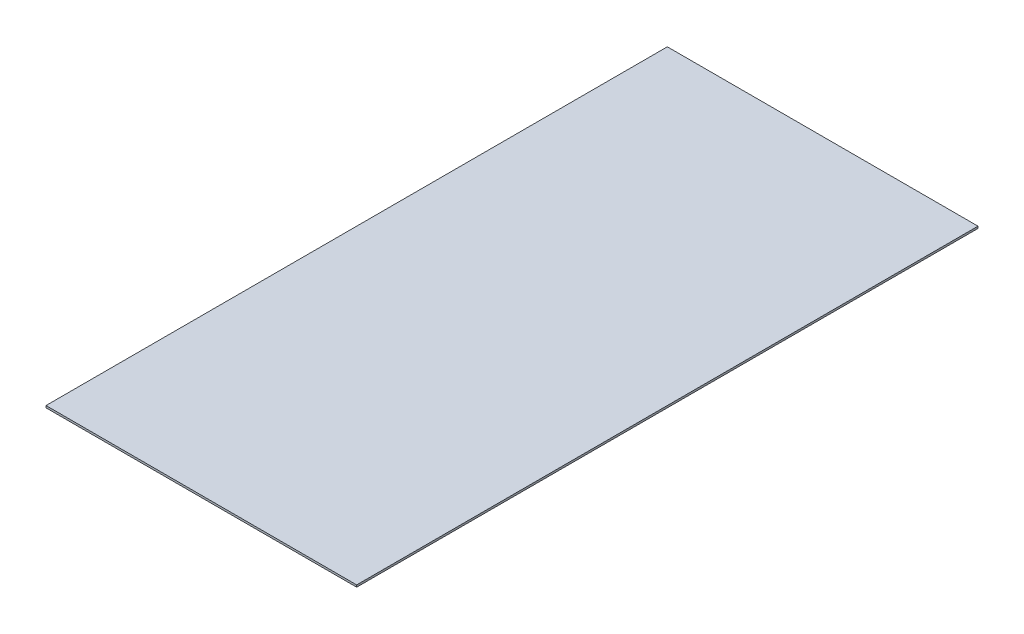
ISO-10303-21;
HEADER;
FILE_DESCRIPTION(('STEP AP214'),'2;1');
FILE_NAME('part.step','',(''),(''),'','','');
FILE_SCHEMA(('AUTOMOTIVE_DESIGN { 1 0 10303 214 1 1 1 1 }'));
ENDSEC;
DATA;
#1=APPLICATION_CONTEXT('core data for automotive mechanical design processes');
#2=APPLICATION_PROTOCOL_DEFINITION('international standard','automotive_design',2000,#1);
#3=PRODUCT_CONTEXT('',#1,'mechanical');
#4=PRODUCT('Part','Part','',(#3));
#5=PRODUCT_RELATED_PRODUCT_CATEGORY('part','',(#4));
#6=PRODUCT_DEFINITION_FORMATION('','',#4);
#7=PRODUCT_DEFINITION_CONTEXT('part definition',#1,'design');
#8=PRODUCT_DEFINITION('design','',#6,#7);
#9=PRODUCT_DEFINITION_SHAPE('','',#8);
#10=(LENGTH_UNIT() NAMED_UNIT(*) SI_UNIT(.MILLI.,.METRE.));
#11=(NAMED_UNIT(*) PLANE_ANGLE_UNIT() SI_UNIT($,.RADIAN.));
#12=(NAMED_UNIT(*) SI_UNIT($,.STERADIAN.) SOLID_ANGLE_UNIT());
#13=UNCERTAINTY_MEASURE_WITH_UNIT(LENGTH_MEASURE(1.E-05),#10,'distance_accuracy_value','');
#14=(GEOMETRIC_REPRESENTATION_CONTEXT(3) GLOBAL_UNCERTAINTY_ASSIGNED_CONTEXT((#13)) GLOBAL_UNIT_ASSIGNED_CONTEXT((#10,
#11,#12)) REPRESENTATION_CONTEXT('',''));
#15=CARTESIAN_POINT('',(0.,0.,0.));
#16=DIRECTION('',(0.,0.,1.));
#17=DIRECTION('',(1.,0.,0.));
#18=AXIS2_PLACEMENT_3D('',#15,#16,#17);
#19=CARTESIAN_POINT('',(609.6,7.9,1219.2));
#20=DIRECTION('',(-1.,0.,0.));
#21=DIRECTION('',(0.,0.,1.));
#22=AXIS2_PLACEMENT_3D('',#19,#20,#21);
#23=PLANE('',#22);
#24=DIRECTION('',(0.,0.,-1.));
#25=VECTOR('',#24,1.);
#26=CARTESIAN_POINT('',(609.6,0.,1219.2));
#27=LINE('',#26,#25);
#28=CARTESIAN_POINT('',(609.6,0.,1219.2));
#29=VERTEX_POINT('',#28);
#30=CARTESIAN_POINT('',(609.6,0.,-1219.2));
#31=VERTEX_POINT('',#30);
#32=EDGE_CURVE('E96',#29,#31,#27,.T.);
#33=ORIENTED_EDGE('',*,*,#32,.T.);
#34=DIRECTION('',(0.,-1.,0.));
#35=VECTOR('',#34,1.);
#36=CARTESIAN_POINT('',(609.6,7.9,-1219.2));
#37=LINE('',#36,#35);
#38=CARTESIAN_POINT('',(609.6,7.9,-1219.2));
#39=VERTEX_POINT('',#38);
#40=EDGE_CURVE('E11',#39,#31,#37,.T.);
#41=ORIENTED_EDGE('',*,*,#40,.F.);
#42=DIRECTION('',(0.,0.,-1.));
#43=VECTOR('',#42,1.);
#44=CARTESIAN_POINT('',(609.6,7.9,1219.2));
#45=LINE('',#44,#43);
#46=CARTESIAN_POINT('',(609.6,7.9,1219.2));
#47=VERTEX_POINT('',#46);
#48=EDGE_CURVE('E84',#47,#39,#45,.T.);
#49=ORIENTED_EDGE('',*,*,#48,.F.);
#50=DIRECTION('',(0.,-1.,0.));
#51=VECTOR('',#50,1.);
#52=CARTESIAN_POINT('',(609.6,7.9,1219.2));
#53=LINE('',#52,#51);
#54=EDGE_CURVE('E92',#47,#29,#53,.T.);
#55=ORIENTED_EDGE('',*,*,#54,.T.);
#56=EDGE_LOOP('',(#33,#41,#49,#55));
#57=FACE_BOUND('',#56,.T.);
#58=ADVANCED_FACE('F33',(#57),#23,.F.);
#59=CARTESIAN_POINT('',(-609.6,7.9,-1219.2));
#60=DIRECTION('',(0.,0.,1.));
#61=DIRECTION('',(1.,0.,0.));
#62=AXIS2_PLACEMENT_3D('',#59,#60,#61);
#63=PLANE('',#62);
#64=DIRECTION('',(-1.,0.,0.));
#65=VECTOR('',#64,1.);
#66=CARTESIAN_POINT('',(-609.6,0.,-1219.2));
#67=LINE('',#66,#65);
#68=CARTESIAN_POINT('',(-609.6,0.,-1219.2));
#69=VERTEX_POINT('',#68);
#70=EDGE_CURVE('E88',#31,#69,#67,.T.);
#71=ORIENTED_EDGE('',*,*,#70,.T.);
#72=DIRECTION('',(0.,-1.,0.));
#73=VECTOR('',#72,1.);
#74=CARTESIAN_POINT('',(-609.6,7.9,-1219.2));
#75=LINE('',#74,#73);
#76=CARTESIAN_POINT('',(-609.6,7.9,-1219.2));
#77=VERTEX_POINT('',#76);
#78=EDGE_CURVE('E41',#77,#69,#75,.T.);
#79=ORIENTED_EDGE('',*,*,#78,.F.);
#80=DIRECTION('',(-1.,0.,0.));
#81=VECTOR('',#80,1.);
#82=CARTESIAN_POINT('',(-609.6,7.9,-1219.2));
#83=LINE('',#82,#81);
#84=EDGE_CURVE('E79',#39,#77,#83,.T.);
#85=ORIENTED_EDGE('',*,*,#84,.F.);
#86=ORIENTED_EDGE('',*,*,#40,.T.);
#87=EDGE_LOOP('',(#71,#79,#85,#86));
#88=FACE_BOUND('',#87,.T.);
#89=ADVANCED_FACE('F87',(#88),#63,.F.);
#90=CARTESIAN_POINT('',(-609.6,7.9,1219.2));
#91=DIRECTION('',(1.,0.,0.));
#92=DIRECTION('',(0.,0.,-1.));
#93=AXIS2_PLACEMENT_3D('',#90,#91,#92);
#94=PLANE('',#93);
#95=DIRECTION('',(0.,0.,1.));
#96=VECTOR('',#95,1.);
#97=CARTESIAN_POINT('',(-609.6,0.,1219.2));
#98=LINE('',#97,#96);
#99=CARTESIAN_POINT('',(-609.6,0.,1219.2));
#100=VERTEX_POINT('',#99);
#101=EDGE_CURVE('E66',#69,#100,#98,.T.);
#102=ORIENTED_EDGE('',*,*,#101,.T.);
#103=DIRECTION('',(0.,-1.,0.));
#104=VECTOR('',#103,1.);
#105=CARTESIAN_POINT('',(-609.6,7.9,1219.2));
#106=LINE('',#105,#104);
#107=CARTESIAN_POINT('',(-609.6,7.9,1219.2));
#108=VERTEX_POINT('',#107);
#109=EDGE_CURVE('E89',#108,#100,#106,.T.);
#110=ORIENTED_EDGE('',*,*,#109,.F.);
#111=DIRECTION('',(0.,0.,1.));
#112=VECTOR('',#111,1.);
#113=CARTESIAN_POINT('',(-609.6,7.9,1219.2));
#114=LINE('',#113,#112);
#115=EDGE_CURVE('E82',#77,#108,#114,.T.);
#116=ORIENTED_EDGE('',*,*,#115,.F.);
#117=ORIENTED_EDGE('',*,*,#78,.T.);
#118=EDGE_LOOP('',(#102,#110,#116,#117));
#119=FACE_BOUND('',#118,.T.);
#120=ADVANCED_FACE('F90',(#119),#94,.F.);
#121=CARTESIAN_POINT('',(-609.6,7.9,1219.2));
#122=DIRECTION('',(0.,0.,-1.));
#123=DIRECTION('',(-1.,0.,0.));
#124=AXIS2_PLACEMENT_3D('',#121,#122,#123);
#125=PLANE('',#124);
#126=DIRECTION('',(1.,0.,0.));
#127=VECTOR('',#126,1.);
#128=CARTESIAN_POINT('',(-609.6,0.,1219.2));
#129=LINE('',#128,#127);
#130=EDGE_CURVE('E72',#100,#29,#129,.T.);
#131=ORIENTED_EDGE('',*,*,#130,.T.);
#132=ORIENTED_EDGE('',*,*,#54,.F.);
#133=DIRECTION('',(1.,0.,0.));
#134=VECTOR('',#133,1.);
#135=CARTESIAN_POINT('',(-609.6,7.9,1219.2));
#136=LINE('',#135,#134);
#137=EDGE_CURVE('E49',#108,#47,#136,.T.);
#138=ORIENTED_EDGE('',*,*,#137,.F.);
#139=ORIENTED_EDGE('',*,*,#109,.T.);
#140=EDGE_LOOP('',(#131,#132,#138,#139));
#141=FACE_BOUND('',#140,.T.);
#142=ADVANCED_FACE('F103',(#141),#125,.F.);
#143=CARTESIAN_POINT('',(0.,7.9,0.));
#144=DIRECTION('',(0.,-1.,0.));
#145=DIRECTION('',(0.,0.,-1.));
#146=AXIS2_PLACEMENT_3D('',#143,#144,#145);
#147=PLANE('',#146);
#148=ORIENTED_EDGE('',*,*,#48,.T.);
#149=ORIENTED_EDGE('',*,*,#84,.T.);
#150=ORIENTED_EDGE('',*,*,#115,.T.);
#151=ORIENTED_EDGE('',*,*,#137,.T.);
#152=EDGE_LOOP('',(#148,#149,#150,#151));
#153=FACE_BOUND('',#152,.T.);
#154=ADVANCED_FACE('F80',(#153),#147,.F.);
#155=CARTESIAN_POINT('',(0.,0.,0.));
#156=DIRECTION('',(0.,-1.,0.));
#157=DIRECTION('',(0.,0.,-1.));
#158=AXIS2_PLACEMENT_3D('',#155,#156,#157);
#159=PLANE('',#158);
#160=ORIENTED_EDGE('',*,*,#32,.F.);
#161=ORIENTED_EDGE('',*,*,#130,.F.);
#162=ORIENTED_EDGE('',*,*,#101,.F.);
#163=ORIENTED_EDGE('',*,*,#70,.F.);
#164=EDGE_LOOP('',(#160,#161,#162,#163));
#165=FACE_BOUND('',#164,.T.);
#166=ADVANCED_FACE('F106',(#165),#159,.T.);
#167=CLOSED_SHELL('',(#58,#89,#120,#142,#154,#166));
#168=MANIFOLD_SOLID_BREP('B2',#167);
#169=ADVANCED_BREP_SHAPE_REPRESENTATION('',(#18,#168),#14);
#170=SHAPE_DEFINITION_REPRESENTATION(#9,#169);
ENDSEC;
END-ISO-10303-21;
